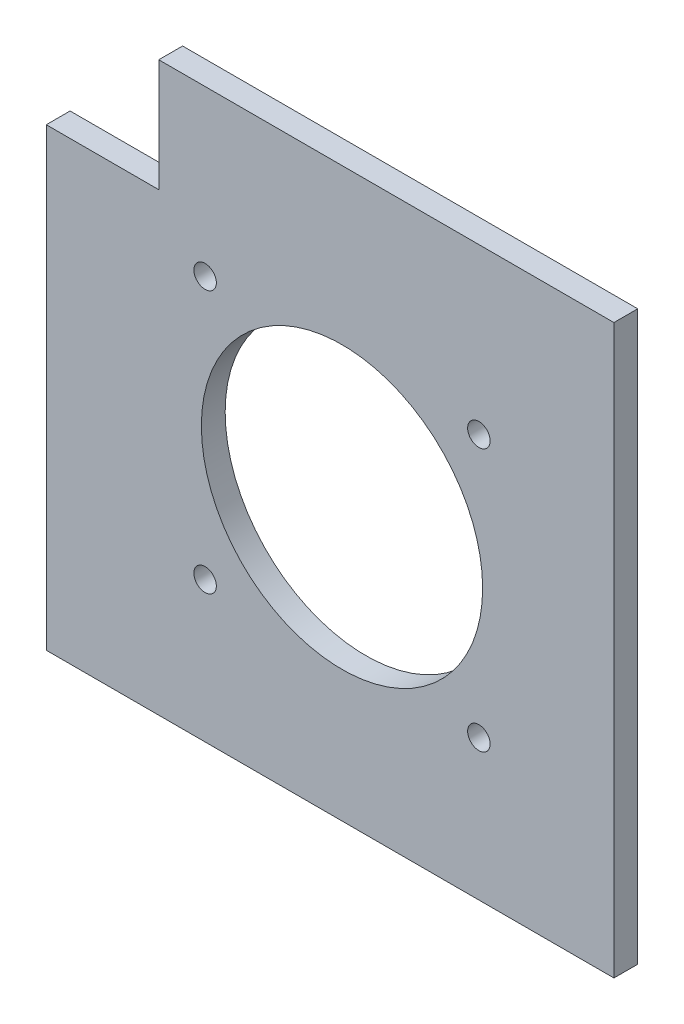
ISO-10303-21;
HEADER;
FILE_DESCRIPTION(('STEP AP214'),'2;1');
FILE_NAME('part.step','',(''),(''),'','','');
FILE_SCHEMA(('AUTOMOTIVE_DESIGN { 1 0 10303 214 1 1 1 1 }'));
ENDSEC;
DATA;
#1=APPLICATION_CONTEXT('core data for automotive mechanical design processes');
#2=APPLICATION_PROTOCOL_DEFINITION('international standard','automotive_design',2000,#1);
#3=PRODUCT_CONTEXT('',#1,'mechanical');
#4=PRODUCT('Part','Part','',(#3));
#5=PRODUCT_RELATED_PRODUCT_CATEGORY('part','',(#4));
#6=PRODUCT_DEFINITION_FORMATION('','',#4);
#7=PRODUCT_DEFINITION_CONTEXT('part definition',#1,'design');
#8=PRODUCT_DEFINITION('design','',#6,#7);
#9=PRODUCT_DEFINITION_SHAPE('','',#8);
#10=(LENGTH_UNIT() NAMED_UNIT(*) SI_UNIT(.MILLI.,.METRE.));
#11=(NAMED_UNIT(*) PLANE_ANGLE_UNIT() SI_UNIT($,.RADIAN.));
#12=(NAMED_UNIT(*) SI_UNIT($,.STERADIAN.) SOLID_ANGLE_UNIT());
#13=UNCERTAINTY_MEASURE_WITH_UNIT(LENGTH_MEASURE(1.E-05),#10,'distance_accuracy_value','');
#14=(GEOMETRIC_REPRESENTATION_CONTEXT(3) GLOBAL_UNCERTAINTY_ASSIGNED_CONTEXT((#13)) GLOBAL_UNIT_ASSIGNED_CONTEXT((#10,
#11,#12)) REPRESENTATION_CONTEXT('',''));
#15=CARTESIAN_POINT('',(0.,0.,0.));
#16=DIRECTION('',(0.,0.,1.));
#17=DIRECTION('',(1.,0.,0.));
#18=AXIS2_PLACEMENT_3D('',#15,#16,#17);
#19=CARTESIAN_POINT('',(100.993484022736,-125.866705607477,6.35));
#20=DIRECTION('',(-1.,0.,0.));
#21=DIRECTION('',(0.,-1.,0.));
#22=AXIS2_PLACEMENT_3D('',#19,#20,#21);
#23=PLANE('',#22);
#24=DIRECTION('',(0.,1.,0.));
#25=VECTOR('',#24,1.);
#26=CARTESIAN_POINT('',(100.993484022736,-125.866705607477,0.));
#27=LINE('',#26,#25);
#28=CARTESIAN_POINT('',(100.993484022736,-125.866705607477,0.));
#29=VERTEX_POINT('',#28);
#30=CARTESIAN_POINT('',(100.993484022736,25.4832943925233,0.));
#31=VERTEX_POINT('',#30);
#32=EDGE_CURVE('E131',#29,#31,#27,.T.);
#33=ORIENTED_EDGE('',*,*,#32,.T.);
#34=DIRECTION('',(0.,0.,-1.));
#35=VECTOR('',#34,1.);
#36=CARTESIAN_POINT('',(100.993484022736,25.4832943925233,6.35));
#37=LINE('',#36,#35);
#38=CARTESIAN_POINT('',(100.993484022736,25.4832943925233,6.35));
#39=VERTEX_POINT('',#38);
#40=EDGE_CURVE('E11',#39,#31,#37,.T.);
#41=ORIENTED_EDGE('',*,*,#40,.F.);
#42=DIRECTION('',(0.,1.,0.));
#43=VECTOR('',#42,1.);
#44=CARTESIAN_POINT('',(100.993484022736,-125.866705607477,6.35));
#45=LINE('',#44,#43);
#46=CARTESIAN_POINT('',(100.993484022736,-125.866705607477,6.35));
#47=VERTEX_POINT('',#46);
#48=EDGE_CURVE('E148',#47,#39,#45,.T.);
#49=ORIENTED_EDGE('',*,*,#48,.F.);
#50=DIRECTION('',(0.,0.,-1.));
#51=VECTOR('',#50,1.);
#52=CARTESIAN_POINT('',(100.993484022736,-125.866705607477,6.35));
#53=LINE('',#52,#51);
#54=EDGE_CURVE('E127',#47,#29,#53,.T.);
#55=ORIENTED_EDGE('',*,*,#54,.T.);
#56=EDGE_LOOP('',(#33,#41,#49,#55));
#57=FACE_BOUND('',#56,.T.);
#58=ADVANCED_FACE('F42',(#57),#23,.F.);
#59=CARTESIAN_POINT('',(100.993484022736,25.4832943925233,6.35));
#60=DIRECTION('',(0.,-1.,0.));
#61=DIRECTION('',(1.,0.,0.));
#62=AXIS2_PLACEMENT_3D('',#59,#60,#61);
#63=PLANE('',#62);
#64=DIRECTION('',(-1.,0.,0.));
#65=VECTOR('',#64,1.);
#66=CARTESIAN_POINT('',(100.993484022736,25.4832943925233,0.));
#67=LINE('',#66,#65);
#68=CARTESIAN_POINT('',(-20.3565159772635,25.4832943925234,0.));
#69=VERTEX_POINT('',#68);
#70=EDGE_CURVE('E135',#31,#69,#67,.T.);
#71=ORIENTED_EDGE('',*,*,#70,.T.);
#72=DIRECTION('',(0.,0.,-1.));
#73=VECTOR('',#72,1.);
#74=CARTESIAN_POINT('',(-20.3565159772635,25.4832943925234,6.35));
#75=LINE('',#74,#73);
#76=CARTESIAN_POINT('',(-20.3565159772635,25.4832943925234,6.35));
#77=VERTEX_POINT('',#76);
#78=EDGE_CURVE('E51',#77,#69,#75,.T.);
#79=ORIENTED_EDGE('',*,*,#78,.F.);
#80=DIRECTION('',(-1.,0.,0.));
#81=VECTOR('',#80,1.);
#82=CARTESIAN_POINT('',(100.993484022736,25.4832943925233,6.35));
#83=LINE('',#82,#81);
#84=EDGE_CURVE('E96',#39,#77,#83,.T.);
#85=ORIENTED_EDGE('',*,*,#84,.F.);
#86=ORIENTED_EDGE('',*,*,#40,.T.);
#87=EDGE_LOOP('',(#71,#79,#85,#86));
#88=FACE_BOUND('',#87,.T.);
#89=ADVANCED_FACE('F178',(#88),#63,.F.);
#90=CARTESIAN_POINT('',(-20.3565159772635,25.4832943925234,6.35));
#91=DIRECTION('',(1.,0.,0.));
#92=DIRECTION('',(0.,0.,-1.));
#93=AXIS2_PLACEMENT_3D('',#90,#91,#92);
#94=PLANE('',#93);
#95=DIRECTION('',(0.,-1.,0.));
#96=VECTOR('',#95,1.);
#97=CARTESIAN_POINT('',(-20.3565159772635,25.4832943925234,0.));
#98=LINE('',#97,#96);
#99=CARTESIAN_POINT('',(-20.3565159772635,-4.51670560747663,0.));
#100=VERTEX_POINT('',#99);
#101=EDGE_CURVE('E139',#69,#100,#98,.T.);
#102=ORIENTED_EDGE('',*,*,#101,.T.);
#103=DIRECTION('',(0.,0.,-1.));
#104=VECTOR('',#103,1.);
#105=CARTESIAN_POINT('',(-20.3565159772635,-4.51670560747663,6.35));
#106=LINE('',#105,#104);
#107=CARTESIAN_POINT('',(-20.3565159772635,-4.51670560747663,6.35));
#108=VERTEX_POINT('',#107);
#109=EDGE_CURVE('E120',#108,#100,#106,.T.);
#110=ORIENTED_EDGE('',*,*,#109,.F.);
#111=DIRECTION('',(0.,-1.,0.));
#112=VECTOR('',#111,1.);
#113=CARTESIAN_POINT('',(-20.3565159772635,25.4832943925234,6.35));
#114=LINE('',#113,#112);
#115=EDGE_CURVE('E109',#77,#108,#114,.T.);
#116=ORIENTED_EDGE('',*,*,#115,.F.);
#117=ORIENTED_EDGE('',*,*,#78,.T.);
#118=EDGE_LOOP('',(#102,#110,#116,#117));
#119=FACE_BOUND('',#118,.T.);
#120=ADVANCED_FACE('F158',(#119),#94,.F.);
#121=CARTESIAN_POINT('',(-50.3565159772635,-4.51670560747663,6.35));
#122=DIRECTION('',(0.,-1.,0.));
#123=DIRECTION('',(0.,0.,-1.));
#124=AXIS2_PLACEMENT_3D('',#121,#122,#123);
#125=PLANE('',#124);
#126=DIRECTION('',(-1.,0.,0.));
#127=VECTOR('',#126,1.);
#128=CARTESIAN_POINT('',(-50.3565159772635,-4.51670560747663,0.));
#129=LINE('',#128,#127);
#130=CARTESIAN_POINT('',(-50.3565159772635,-4.51670560747663,0.));
#131=VERTEX_POINT('',#130);
#132=EDGE_CURVE('E118',#100,#131,#129,.T.);
#133=ORIENTED_EDGE('',*,*,#132,.T.);
#134=DIRECTION('',(0.,0.,-1.));
#135=VECTOR('',#134,1.);
#136=CARTESIAN_POINT('',(-50.3565159772635,-4.51670560747663,6.35));
#137=LINE('',#136,#135);
#138=CARTESIAN_POINT('',(-50.3565159772635,-4.51670560747663,6.35));
#139=VERTEX_POINT('',#138);
#140=EDGE_CURVE('E115',#139,#131,#137,.T.);
#141=ORIENTED_EDGE('',*,*,#140,.F.);
#142=DIRECTION('',(-1.,0.,0.));
#143=VECTOR('',#142,1.);
#144=CARTESIAN_POINT('',(-50.3565159772635,-4.51670560747663,6.35));
#145=LINE('',#144,#143);
#146=EDGE_CURVE('E103',#108,#139,#145,.T.);
#147=ORIENTED_EDGE('',*,*,#146,.F.);
#148=ORIENTED_EDGE('',*,*,#109,.T.);
#149=EDGE_LOOP('',(#133,#141,#147,#148));
#150=FACE_BOUND('',#149,.T.);
#151=ADVANCED_FACE('F116',(#150),#125,.F.);
#152=CARTESIAN_POINT('',(-50.3565159772635,-4.51670560747663,6.35));
#153=DIRECTION('',(1.,0.,0.));
#154=DIRECTION('',(0.,0.,-1.));
#155=AXIS2_PLACEMENT_3D('',#152,#153,#154);
#156=PLANE('',#155);
#157=DIRECTION('',(0.,-1.,0.));
#158=VECTOR('',#157,1.);
#159=CARTESIAN_POINT('',(-50.3565159772635,-4.51670560747663,0.));
#160=LINE('',#159,#158);
#161=CARTESIAN_POINT('',(-50.3565159772635,-125.866705607477,0.));
#162=VERTEX_POINT('',#161);
#163=EDGE_CURVE('E82',#131,#162,#160,.T.);
#164=ORIENTED_EDGE('',*,*,#163,.T.);
#165=DIRECTION('',(0.,0.,-1.));
#166=VECTOR('',#165,1.);
#167=CARTESIAN_POINT('',(-50.3565159772635,-125.866705607477,6.35));
#168=LINE('',#167,#166);
#169=CARTESIAN_POINT('',(-50.3565159772635,-125.866705607477,6.35));
#170=VERTEX_POINT('',#169);
#171=EDGE_CURVE('E121',#170,#162,#168,.T.);
#172=ORIENTED_EDGE('',*,*,#171,.F.);
#173=DIRECTION('',(0.,-1.,0.));
#174=VECTOR('',#173,1.);
#175=CARTESIAN_POINT('',(-50.3565159772635,-4.51670560747663,6.35));
#176=LINE('',#175,#174);
#177=EDGE_CURVE('E107',#139,#170,#176,.T.);
#178=ORIENTED_EDGE('',*,*,#177,.F.);
#179=ORIENTED_EDGE('',*,*,#140,.T.);
#180=EDGE_LOOP('',(#164,#172,#178,#179));
#181=FACE_BOUND('',#180,.T.);
#182=ADVANCED_FACE('F123',(#181),#156,.F.);
#183=CARTESIAN_POINT('',(-50.3565159772635,-125.866705607477,6.35));
#184=DIRECTION('',(0.,1.,0.));
#185=DIRECTION('',(-1.,0.,0.));
#186=AXIS2_PLACEMENT_3D('',#183,#184,#185);
#187=PLANE('',#186);
#188=DIRECTION('',(1.,0.,0.));
#189=VECTOR('',#188,1.);
#190=CARTESIAN_POINT('',(-50.3565159772635,-125.866705607477,0.));
#191=LINE('',#190,#189);
#192=EDGE_CURVE('E88',#162,#29,#191,.T.);
#193=ORIENTED_EDGE('',*,*,#192,.T.);
#194=ORIENTED_EDGE('',*,*,#54,.F.);
#195=DIRECTION('',(1.,0.,0.));
#196=VECTOR('',#195,1.);
#197=CARTESIAN_POINT('',(-50.3565159772635,-125.866705607477,6.35));
#198=LINE('',#197,#196);
#199=EDGE_CURVE('E59',#170,#47,#198,.T.);
#200=ORIENTED_EDGE('',*,*,#199,.F.);
#201=ORIENTED_EDGE('',*,*,#171,.T.);
#202=EDGE_LOOP('',(#193,#194,#200,#201));
#203=FACE_BOUND('',#202,.T.);
#204=ADVANCED_FACE('F165',(#203),#187,.F.);
#205=CARTESIAN_POINT('',(0.,0.,6.35));
#206=DIRECTION('',(0.,0.,1.));
#207=DIRECTION('',(1.,0.,0.));
#208=AXIS2_PLACEMENT_3D('',#205,#206,#207);
#209=PLANE('',#208);
#210=CARTESIAN_POINT('',(64.9934840227365,-88.3667056074767,6.35));
#211=DIRECTION('',(0.,0.,1.));
#212=DIRECTION('',(-1.,0.,0.));
#213=AXIS2_PLACEMENT_3D('',#210,#211,#212);
#214=CIRCLE('',#213,3.00000000000001);
#215=CARTESIAN_POINT('',(61.9934840227365,-88.3667056074767,6.35));
#216=VERTEX_POINT('',#215);
#217=EDGE_CURVE('E313',#216,#216,#214,.T.);
#218=ORIENTED_EDGE('',*,*,#217,.F.);
#219=EDGE_LOOP('',(#218));
#220=FACE_BOUND('',#219,.T.);
#221=CARTESIAN_POINT('',(64.9934840227365,-18.3667056074766,6.35));
#222=DIRECTION('',(0.,0.,1.));
#223=DIRECTION('',(-1.,0.,0.));
#224=AXIS2_PLACEMENT_3D('',#221,#222,#223);
#225=CIRCLE('',#224,3.00000000000001);
#226=CARTESIAN_POINT('',(61.9934840227365,-18.3667056074766,6.35));
#227=VERTEX_POINT('',#226);
#228=EDGE_CURVE('E320',#227,#227,#225,.T.);
#229=ORIENTED_EDGE('',*,*,#228,.F.);
#230=EDGE_LOOP('',(#229));
#231=FACE_BOUND('',#230,.T.);
#232=CARTESIAN_POINT('',(-8.0065159772635,-88.3667056074767,6.35));
#233=DIRECTION('',(0.,0.,1.));
#234=DIRECTION('',(1.,0.,0.));
#235=AXIS2_PLACEMENT_3D('',#232,#233,#234);
#236=CIRCLE('',#235,3.);
#237=CARTESIAN_POINT('',(-5.0065159772635,-88.3667056074767,6.35));
#238=VERTEX_POINT('',#237);
#239=EDGE_CURVE('E344',#238,#238,#236,.T.);
#240=ORIENTED_EDGE('',*,*,#239,.F.);
#241=EDGE_LOOP('',(#240));
#242=FACE_BOUND('',#241,.T.);
#243=CARTESIAN_POINT('',(-8.00651597726351,-18.3667056074766,6.35));
#244=DIRECTION('',(0.,0.,1.));
#245=DIRECTION('',(1.,0.,0.));
#246=AXIS2_PLACEMENT_3D('',#243,#244,#245);
#247=CIRCLE('',#246,3.);
#248=CARTESIAN_POINT('',(-5.00651597726351,-18.3667056074766,6.35));
#249=VERTEX_POINT('',#248);
#250=EDGE_CURVE('E332',#249,#249,#247,.T.);
#251=ORIENTED_EDGE('',*,*,#250,.F.);
#252=EDGE_LOOP('',(#251));
#253=FACE_BOUND('',#252,.T.);
#254=CARTESIAN_POINT('',(28.4934840227365,-53.3667056074766,6.35));
#255=DIRECTION('',(0.,0.,1.));
#256=DIRECTION('',(1.,0.,0.));
#257=AXIS2_PLACEMENT_3D('',#254,#255,#256);
#258=CIRCLE('',#257,37.5);
#259=CARTESIAN_POINT('',(65.9934840227365,-53.3667056074766,6.35));
#260=VERTEX_POINT('',#259);
#261=EDGE_CURVE('E328',#260,#260,#258,.T.);
#262=ORIENTED_EDGE('',*,*,#261,.F.);
#263=EDGE_LOOP('',(#262));
#264=FACE_BOUND('',#263,.T.);
#265=ORIENTED_EDGE('',*,*,#48,.T.);
#266=ORIENTED_EDGE('',*,*,#84,.T.);
#267=ORIENTED_EDGE('',*,*,#115,.T.);
#268=ORIENTED_EDGE('',*,*,#146,.T.);
#269=ORIENTED_EDGE('',*,*,#177,.T.);
#270=ORIENTED_EDGE('',*,*,#199,.T.);
#271=EDGE_LOOP('',(#265,#266,#267,#268,#269,#270));
#272=FACE_BOUND('',#271,.T.);
#273=ADVANCED_FACE('F105',(#220,#231,#242,#253,#264,#272),#209,.T.);
#274=CARTESIAN_POINT('',(0.,0.,0.));
#275=DIRECTION('',(0.,0.,1.));
#276=DIRECTION('',(1.,0.,0.));
#277=AXIS2_PLACEMENT_3D('',#274,#275,#276);
#278=PLANE('',#277);
#279=CARTESIAN_POINT('',(64.9934840227365,-88.3667056074767,0.));
#280=DIRECTION('',(0.,0.,1.));
#281=DIRECTION('',(-1.,0.,0.));
#282=AXIS2_PLACEMENT_3D('',#279,#280,#281);
#283=CIRCLE('',#282,3.00000000000001);
#284=CARTESIAN_POINT('',(61.9934840227365,-88.3667056074767,0.));
#285=VERTEX_POINT('',#284);
#286=EDGE_CURVE('E310',#285,#285,#283,.T.);
#287=ORIENTED_EDGE('',*,*,#286,.T.);
#288=EDGE_LOOP('',(#287));
#289=FACE_BOUND('',#288,.T.);
#290=CARTESIAN_POINT('',(64.9934840227365,-18.3667056074766,0.));
#291=DIRECTION('',(0.,0.,1.));
#292=DIRECTION('',(-1.,0.,0.));
#293=AXIS2_PLACEMENT_3D('',#290,#291,#292);
#294=CIRCLE('',#293,3.00000000000001);
#295=CARTESIAN_POINT('',(61.9934840227365,-18.3667056074766,0.));
#296=VERTEX_POINT('',#295);
#297=EDGE_CURVE('E315',#296,#296,#294,.T.);
#298=ORIENTED_EDGE('',*,*,#297,.T.);
#299=EDGE_LOOP('',(#298));
#300=FACE_BOUND('',#299,.T.);
#301=CARTESIAN_POINT('',(-8.0065159772635,-88.3667056074767,0.));
#302=DIRECTION('',(0.,0.,1.));
#303=DIRECTION('',(1.,0.,0.));
#304=AXIS2_PLACEMENT_3D('',#301,#302,#303);
#305=CIRCLE('',#304,3.);
#306=CARTESIAN_POINT('',(-5.0065159772635,-88.3667056074767,0.));
#307=VERTEX_POINT('',#306);
#308=EDGE_CURVE('E348',#307,#307,#305,.T.);
#309=ORIENTED_EDGE('',*,*,#308,.T.);
#310=EDGE_LOOP('',(#309));
#311=FACE_BOUND('',#310,.T.);
#312=CARTESIAN_POINT('',(-8.00651597726351,-18.3667056074766,0.));
#313=DIRECTION('',(0.,0.,1.));
#314=DIRECTION('',(1.,0.,0.));
#315=AXIS2_PLACEMENT_3D('',#312,#313,#314);
#316=CIRCLE('',#315,3.);
#317=CARTESIAN_POINT('',(-5.00651597726351,-18.3667056074766,0.));
#318=VERTEX_POINT('',#317);
#319=EDGE_CURVE('E340',#318,#318,#316,.T.);
#320=ORIENTED_EDGE('',*,*,#319,.T.);
#321=EDGE_LOOP('',(#320));
#322=FACE_BOUND('',#321,.T.);
#323=CARTESIAN_POINT('',(28.4934840227365,-53.3667056074766,0.));
#324=DIRECTION('',(0.,0.,1.));
#325=DIRECTION('',(1.,0.,0.));
#326=AXIS2_PLACEMENT_3D('',#323,#324,#325);
#327=CIRCLE('',#326,37.5);
#328=CARTESIAN_POINT('',(65.9934840227365,-53.3667056074766,0.));
#329=VERTEX_POINT('',#328);
#330=EDGE_CURVE('E136',#329,#329,#327,.T.);
#331=ORIENTED_EDGE('',*,*,#330,.T.);
#332=EDGE_LOOP('',(#331));
#333=FACE_BOUND('',#332,.T.);
#334=ORIENTED_EDGE('',*,*,#32,.F.);
#335=ORIENTED_EDGE('',*,*,#192,.F.);
#336=ORIENTED_EDGE('',*,*,#163,.F.);
#337=ORIENTED_EDGE('',*,*,#132,.F.);
#338=ORIENTED_EDGE('',*,*,#101,.F.);
#339=ORIENTED_EDGE('',*,*,#70,.F.);
#340=EDGE_LOOP('',(#334,#335,#336,#337,#338,#339));
#341=FACE_BOUND('',#340,.T.);
#342=ADVANCED_FACE('F161',(#289,#300,#311,#322,#333,#341),#278,.F.);
#343=CARTESIAN_POINT('',(28.4934840227365,-53.3667056074766,0.));
#344=DIRECTION('',(0.,0.,1.));
#345=DIRECTION('',(1.,0.,0.));
#346=AXIS2_PLACEMENT_3D('',#343,#344,#345);
#347=CYLINDRICAL_SURFACE('',#346,37.5);
#348=ORIENTED_EDGE('',*,*,#330,.F.);
#349=EDGE_LOOP('',(#348));
#350=FACE_BOUND('',#349,.T.);
#351=ORIENTED_EDGE('',*,*,#261,.T.);
#352=EDGE_LOOP('',(#351));
#353=FACE_BOUND('',#352,.T.);
#354=ADVANCED_FACE('F213',(#350,#353),#347,.F.);
#355=CARTESIAN_POINT('',(-8.00651597726351,-18.3667056074766,0.));
#356=DIRECTION('',(0.,0.,1.));
#357=DIRECTION('',(1.,0.,0.));
#358=AXIS2_PLACEMENT_3D('',#355,#356,#357);
#359=CYLINDRICAL_SURFACE('',#358,3.);
#360=ORIENTED_EDGE('',*,*,#319,.F.);
#361=EDGE_LOOP('',(#360));
#362=FACE_BOUND('',#361,.T.);
#363=ORIENTED_EDGE('',*,*,#250,.T.);
#364=EDGE_LOOP('',(#363));
#365=FACE_BOUND('',#364,.T.);
#366=ADVANCED_FACE('F221',(#362,#365),#359,.F.);
#367=CARTESIAN_POINT('',(-8.0065159772635,-88.3667056074767,0.));
#368=DIRECTION('',(0.,0.,1.));
#369=DIRECTION('',(1.,0.,0.));
#370=AXIS2_PLACEMENT_3D('',#367,#368,#369);
#371=CYLINDRICAL_SURFACE('',#370,3.);
#372=ORIENTED_EDGE('',*,*,#308,.F.);
#373=EDGE_LOOP('',(#372));
#374=FACE_BOUND('',#373,.T.);
#375=ORIENTED_EDGE('',*,*,#239,.T.);
#376=EDGE_LOOP('',(#375));
#377=FACE_BOUND('',#376,.T.);
#378=ADVANCED_FACE('F232',(#374,#377),#371,.F.);
#379=CARTESIAN_POINT('',(64.9934840227365,-18.3667056074766,0.));
#380=DIRECTION('',(0.,0.,1.));
#381=DIRECTION('',(1.,0.,0.));
#382=AXIS2_PLACEMENT_3D('',#379,#380,#381);
#383=CYLINDRICAL_SURFACE('',#382,3.00000000000001);
#384=ORIENTED_EDGE('',*,*,#297,.F.);
#385=EDGE_LOOP('',(#384));
#386=FACE_BOUND('',#385,.T.);
#387=ORIENTED_EDGE('',*,*,#228,.T.);
#388=EDGE_LOOP('',(#387));
#389=FACE_BOUND('',#388,.T.);
#390=ADVANCED_FACE('F243',(#386,#389),#383,.F.);
#391=CARTESIAN_POINT('',(64.9934840227365,-88.3667056074767,0.));
#392=DIRECTION('',(0.,0.,1.));
#393=DIRECTION('',(1.,0.,0.));
#394=AXIS2_PLACEMENT_3D('',#391,#392,#393);
#395=CYLINDRICAL_SURFACE('',#394,3.00000000000001);
#396=ORIENTED_EDGE('',*,*,#286,.F.);
#397=EDGE_LOOP('',(#396));
#398=FACE_BOUND('',#397,.T.);
#399=ORIENTED_EDGE('',*,*,#217,.T.);
#400=EDGE_LOOP('',(#399));
#401=FACE_BOUND('',#400,.T.);
#402=ADVANCED_FACE('F254',(#398,#401),#395,.F.);
#403=CLOSED_SHELL('',(#58,#89,#120,#151,#182,#204,#273,#342,#354,#366,#378,#390,#402));
#404=MANIFOLD_SOLID_BREP('B2',#403);
#405=ADVANCED_BREP_SHAPE_REPRESENTATION('',(#18,#404),#14);
#406=SHAPE_DEFINITION_REPRESENTATION(#9,#405);
ENDSEC;
END-ISO-10303-21;
